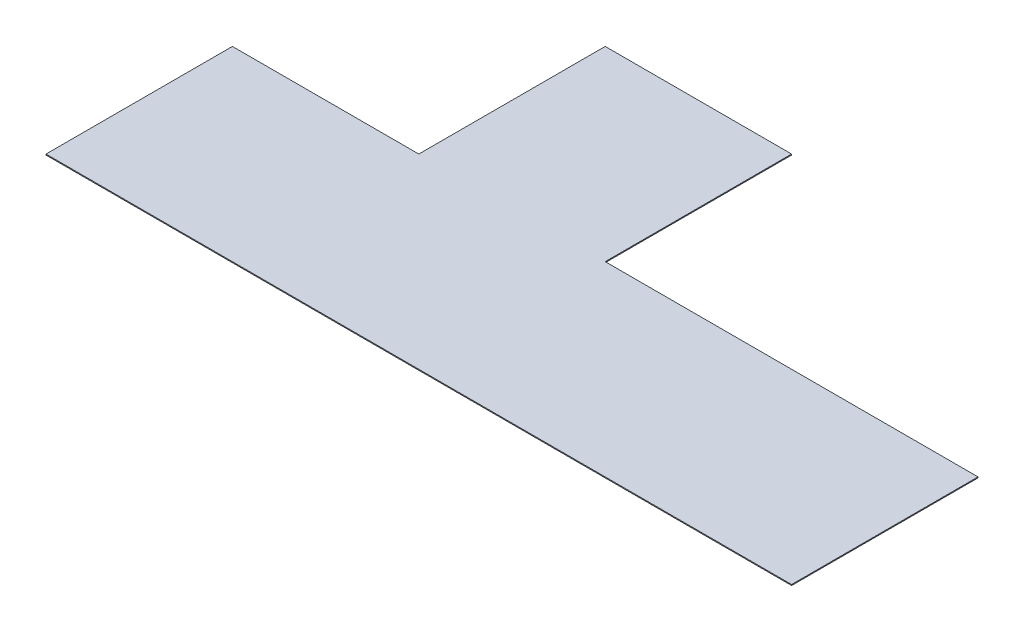
ISO-10303-21;
HEADER;
FILE_DESCRIPTION(('STEP AP214'),'2;1');
FILE_NAME('part.step','',(''),(''),'','','');
FILE_SCHEMA(('AUTOMOTIVE_DESIGN { 1 0 10303 214 1 1 1 1 }'));
ENDSEC;
DATA;
#1=APPLICATION_CONTEXT('core data for automotive mechanical design processes');
#2=APPLICATION_PROTOCOL_DEFINITION('international standard','automotive_design',2000,#1);
#3=PRODUCT_CONTEXT('',#1,'mechanical');
#4=PRODUCT('Part','Part','',(#3));
#5=PRODUCT_RELATED_PRODUCT_CATEGORY('part','',(#4));
#6=PRODUCT_DEFINITION_FORMATION('','',#4);
#7=PRODUCT_DEFINITION_CONTEXT('part definition',#1,'design');
#8=PRODUCT_DEFINITION('design','',#6,#7);
#9=PRODUCT_DEFINITION_SHAPE('','',#8);
#10=(LENGTH_UNIT() NAMED_UNIT(*) SI_UNIT(.MILLI.,.METRE.));
#11=(NAMED_UNIT(*) PLANE_ANGLE_UNIT() SI_UNIT($,.RADIAN.));
#12=(NAMED_UNIT(*) SI_UNIT($,.STERADIAN.) SOLID_ANGLE_UNIT());
#13=UNCERTAINTY_MEASURE_WITH_UNIT(LENGTH_MEASURE(1.E-05),#10,'distance_accuracy_value','');
#14=(GEOMETRIC_REPRESENTATION_CONTEXT(3) GLOBAL_UNCERTAINTY_ASSIGNED_CONTEXT((#13)) GLOBAL_UNIT_ASSIGNED_CONTEXT((#10,
#11,#12)) REPRESENTATION_CONTEXT('',''));
#15=CARTESIAN_POINT('',(0.,0.,0.));
#16=DIRECTION('',(0.,0.,1.));
#17=DIRECTION('',(1.,0.,0.));
#18=AXIS2_PLACEMENT_3D('',#15,#16,#17);
#19=CARTESIAN_POINT('',(4.37318429210749,2.601,2.65519290970218E-13));
#20=DIRECTION('',(1.,0.,0.));
#21=DIRECTION('',(0.,0.,-1.));
#22=AXIS2_PLACEMENT_3D('',#19,#20,#21);
#23=PLANE('',#22);
#24=DIRECTION('',(0.,0.,1.));
#25=VECTOR('',#24,1.);
#26=CARTESIAN_POINT('',(4.37318429210749,2.6,2.65519290970218E-13));
#27=LINE('',#26,#25);
#28=CARTESIAN_POINT('',(4.37318429210738,2.6,1.71907068929163));
#29=VERTEX_POINT('',#28);
#30=CARTESIAN_POINT('',(4.37318429210738,2.6,1.91907068929162));
#31=VERTEX_POINT('',#30);
#32=EDGE_CURVE('E11',#29,#31,#27,.T.);
#33=ORIENTED_EDGE('',*,*,#32,.F.);
#34=DIRECTION('',(0.,-1.,0.));
#35=VECTOR('',#34,1.);
#36=CARTESIAN_POINT('',(4.37318429210738,2.601,1.71907068929163));
#37=LINE('',#36,#35);
#38=CARTESIAN_POINT('',(4.37318429210738,2.601,1.71907068929163));
#39=VERTEX_POINT('',#38);
#40=EDGE_CURVE('E24',#39,#29,#37,.T.);
#41=ORIENTED_EDGE('',*,*,#40,.F.);
#42=DIRECTION('',(0.,0.,1.));
#43=VECTOR('',#42,1.);
#44=CARTESIAN_POINT('',(4.37318429210749,2.601,2.65519290970218E-13));
#45=LINE('',#44,#43);
#46=CARTESIAN_POINT('',(4.37318429210738,2.601,1.91907068929162));
#47=VERTEX_POINT('',#46);
#48=EDGE_CURVE('E145',#39,#47,#45,.T.);
#49=ORIENTED_EDGE('',*,*,#48,.T.);
#50=DIRECTION('',(0.,-1.,0.));
#51=VECTOR('',#50,1.);
#52=CARTESIAN_POINT('',(4.37318429210738,2.601,1.91907068929162));
#53=LINE('',#52,#51);
#54=EDGE_CURVE('E102',#47,#31,#53,.T.);
#55=ORIENTED_EDGE('',*,*,#54,.T.);
#56=EDGE_LOOP('',(#33,#41,#49,#55));
#57=FACE_BOUND('',#56,.T.);
#58=ADVANCED_FACE('F17',(#57),#23,.T.);
#59=CARTESIAN_POINT('',(0.,2.601,1.71907068929163));
#60=DIRECTION('',(0.,0.,-1.));
#61=DIRECTION('',(-1.,0.,0.));
#62=AXIS2_PLACEMENT_3D('',#59,#60,#61);
#63=PLANE('',#62);
#64=DIRECTION('',(1.,0.,0.));
#65=VECTOR('',#64,1.);
#66=CARTESIAN_POINT('',(0.,2.6,1.71907068929163));
#67=LINE('',#66,#65);
#68=CARTESIAN_POINT('',(4.17318429210773,2.6,1.71907068929163));
#69=VERTEX_POINT('',#68);
#70=EDGE_CURVE('E142',#69,#29,#67,.T.);
#71=ORIENTED_EDGE('',*,*,#70,.F.);
#72=DIRECTION('',(0.,-1.,0.));
#73=VECTOR('',#72,1.);
#74=CARTESIAN_POINT('',(4.17318429210773,2.601,1.71907068929163));
#75=LINE('',#74,#73);
#76=CARTESIAN_POINT('',(4.17318429210773,2.601,1.71907068929163));
#77=VERTEX_POINT('',#76);
#78=EDGE_CURVE('E139',#77,#69,#75,.T.);
#79=ORIENTED_EDGE('',*,*,#78,.F.);
#80=DIRECTION('',(1.,0.,0.));
#81=VECTOR('',#80,1.);
#82=CARTESIAN_POINT('',(0.,2.601,1.71907068929163));
#83=LINE('',#82,#81);
#84=EDGE_CURVE('E136',#77,#39,#83,.T.);
#85=ORIENTED_EDGE('',*,*,#84,.T.);
#86=ORIENTED_EDGE('',*,*,#40,.T.);
#87=EDGE_LOOP('',(#71,#79,#85,#86));
#88=FACE_BOUND('',#87,.T.);
#89=ADVANCED_FACE('F147',(#88),#63,.T.);
#90=CARTESIAN_POINT('',(4.17318429210783,2.601,2.35277924735658E-13));
#91=DIRECTION('',(1.,0.,0.));
#92=DIRECTION('',(0.,0.,-1.));
#93=AXIS2_PLACEMENT_3D('',#90,#91,#92);
#94=PLANE('',#93);
#95=DIRECTION('',(0.,0.,1.));
#96=VECTOR('',#95,1.);
#97=CARTESIAN_POINT('',(4.17318429210783,2.6,2.35277924735658E-13));
#98=LINE('',#97,#96);
#99=CARTESIAN_POINT('',(4.17318429210772,2.6,1.91907068929162));
#100=VERTEX_POINT('',#99);
#101=EDGE_CURVE('E134',#69,#100,#98,.T.);
#102=ORIENTED_EDGE('',*,*,#101,.T.);
#103=DIRECTION('',(0.,-1.,0.));
#104=VECTOR('',#103,1.);
#105=CARTESIAN_POINT('',(4.17318429210772,2.601,1.91907068929162));
#106=LINE('',#105,#104);
#107=CARTESIAN_POINT('',(4.17318429210772,2.601,1.91907068929162));
#108=VERTEX_POINT('',#107);
#109=EDGE_CURVE('E131',#108,#100,#106,.T.);
#110=ORIENTED_EDGE('',*,*,#109,.F.);
#111=DIRECTION('',(0.,0.,1.));
#112=VECTOR('',#111,1.);
#113=CARTESIAN_POINT('',(4.17318429210783,2.601,2.35277924735658E-13));
#114=LINE('',#113,#112);
#115=EDGE_CURVE('E128',#77,#108,#114,.T.);
#116=ORIENTED_EDGE('',*,*,#115,.F.);
#117=ORIENTED_EDGE('',*,*,#78,.T.);
#118=EDGE_LOOP('',(#102,#110,#116,#117));
#119=FACE_BOUND('',#118,.T.);
#120=ADVANCED_FACE('F153',(#119),#94,.F.);
#121=CARTESIAN_POINT('',(0.,2.601,1.91907068929162));
#122=DIRECTION('',(0.,0.,-1.));
#123=DIRECTION('',(-1.,0.,0.));
#124=AXIS2_PLACEMENT_3D('',#121,#122,#123);
#125=PLANE('',#124);
#126=DIRECTION('',(1.,0.,0.));
#127=VECTOR('',#126,1.);
#128=CARTESIAN_POINT('',(0.,2.6,1.91907068929162));
#129=LINE('',#128,#127);
#130=CARTESIAN_POINT('',(3.97318429210807,2.6,1.91907068929162));
#131=VERTEX_POINT('',#130);
#132=EDGE_CURVE('E125',#131,#100,#129,.T.);
#133=ORIENTED_EDGE('',*,*,#132,.F.);
#134=DIRECTION('',(0.,-1.,0.));
#135=VECTOR('',#134,1.);
#136=CARTESIAN_POINT('',(3.97318429210807,2.601,1.91907068929162));
#137=LINE('',#136,#135);
#138=CARTESIAN_POINT('',(3.97318429210807,2.601,1.91907068929162));
#139=VERTEX_POINT('',#138);
#140=EDGE_CURVE('E122',#139,#131,#137,.T.);
#141=ORIENTED_EDGE('',*,*,#140,.F.);
#142=DIRECTION('',(1.,0.,0.));
#143=VECTOR('',#142,1.);
#144=CARTESIAN_POINT('',(0.,2.601,1.91907068929162));
#145=LINE('',#144,#143);
#146=EDGE_CURVE('E119',#139,#108,#145,.T.);
#147=ORIENTED_EDGE('',*,*,#146,.T.);
#148=ORIENTED_EDGE('',*,*,#109,.T.);
#149=EDGE_LOOP('',(#133,#141,#147,#148));
#150=FACE_BOUND('',#149,.T.);
#151=ADVANCED_FACE('F156',(#150),#125,.T.);
#152=CARTESIAN_POINT('',(3.97318429210807,2.601,0.));
#153=DIRECTION('',(1.,0.,0.));
#154=DIRECTION('',(0.,0.,-1.));
#155=AXIS2_PLACEMENT_3D('',#152,#153,#154);
#156=PLANE('',#155);
#157=DIRECTION('',(0.,0.,1.));
#158=VECTOR('',#157,1.);
#159=CARTESIAN_POINT('',(3.97318429210807,2.6,0.));
#160=LINE('',#159,#158);
#161=CARTESIAN_POINT('',(3.97318429210807,2.6,2.11907068929162));
#162=VERTEX_POINT('',#161);
#163=EDGE_CURVE('E117',#131,#162,#160,.T.);
#164=ORIENTED_EDGE('',*,*,#163,.T.);
#165=DIRECTION('',(0.,-1.,0.));
#166=VECTOR('',#165,1.);
#167=CARTESIAN_POINT('',(3.97318429210807,2.601,2.11907068929162));
#168=LINE('',#167,#166);
#169=CARTESIAN_POINT('',(3.97318429210807,2.601,2.11907068929162));
#170=VERTEX_POINT('',#169);
#171=EDGE_CURVE('E114',#170,#162,#168,.T.);
#172=ORIENTED_EDGE('',*,*,#171,.F.);
#173=DIRECTION('',(0.,0.,1.));
#174=VECTOR('',#173,1.);
#175=CARTESIAN_POINT('',(3.97318429210807,2.601,0.));
#176=LINE('',#175,#174);
#177=EDGE_CURVE('E112',#139,#170,#176,.T.);
#178=ORIENTED_EDGE('',*,*,#177,.F.);
#179=ORIENTED_EDGE('',*,*,#140,.T.);
#180=EDGE_LOOP('',(#164,#172,#178,#179));
#181=FACE_BOUND('',#180,.T.);
#182=ADVANCED_FACE('F160',(#181),#156,.F.);
#183=CARTESIAN_POINT('',(0.,2.601,2.11907068929162));
#184=DIRECTION('',(0.,0.,-1.));
#185=DIRECTION('',(-1.,0.,0.));
#186=AXIS2_PLACEMENT_3D('',#183,#184,#185);
#187=PLANE('',#186);
#188=DIRECTION('',(1.,0.,0.));
#189=VECTOR('',#188,1.);
#190=CARTESIAN_POINT('',(0.,2.6,2.11907068929162));
#191=LINE('',#190,#189);
#192=CARTESIAN_POINT('',(4.7731842921067,2.6,2.11907068929162));
#193=VERTEX_POINT('',#192);
#194=EDGE_CURVE('E110',#162,#193,#191,.T.);
#195=ORIENTED_EDGE('',*,*,#194,.T.);
#196=DIRECTION('',(0.,-1.,0.));
#197=VECTOR('',#196,1.);
#198=CARTESIAN_POINT('',(4.7731842921067,2.601,2.11907068929162));
#199=LINE('',#198,#197);
#200=CARTESIAN_POINT('',(4.7731842921067,2.601,2.11907068929162));
#201=VERTEX_POINT('',#200);
#202=EDGE_CURVE('E108',#201,#193,#199,.T.);
#203=ORIENTED_EDGE('',*,*,#202,.F.);
#204=DIRECTION('',(1.,0.,0.));
#205=VECTOR('',#204,1.);
#206=CARTESIAN_POINT('',(0.,2.601,2.11907068929162));
#207=LINE('',#206,#205);
#208=EDGE_CURVE('E97',#170,#201,#207,.T.);
#209=ORIENTED_EDGE('',*,*,#208,.F.);
#210=ORIENTED_EDGE('',*,*,#171,.T.);
#211=EDGE_LOOP('',(#195,#203,#209,#210));
#212=FACE_BOUND('',#211,.T.);
#213=ADVANCED_FACE('F163',(#212),#187,.F.);
#214=CARTESIAN_POINT('',(4.77318429210682,2.601,2.69105032517149E-13));
#215=DIRECTION('',(1.,0.,0.));
#216=DIRECTION('',(0.,0.,-1.));
#217=AXIS2_PLACEMENT_3D('',#214,#215,#216);
#218=PLANE('',#217);
#219=DIRECTION('',(0.,0.,1.));
#220=VECTOR('',#219,1.);
#221=CARTESIAN_POINT('',(4.77318429210682,2.6,2.69105032517149E-13));
#222=LINE('',#221,#220);
#223=CARTESIAN_POINT('',(4.7731842921067,2.6,1.91907068929162));
#224=VERTEX_POINT('',#223);
#225=EDGE_CURVE('E84',#224,#193,#222,.T.);
#226=ORIENTED_EDGE('',*,*,#225,.F.);
#227=DIRECTION('',(0.,-1.,0.));
#228=VECTOR('',#227,1.);
#229=CARTESIAN_POINT('',(4.7731842921067,2.601,1.91907068929162));
#230=LINE('',#229,#228);
#231=CARTESIAN_POINT('',(4.7731842921067,2.601,1.91907068929162));
#232=VERTEX_POINT('',#231);
#233=EDGE_CURVE('E78',#232,#224,#230,.T.);
#234=ORIENTED_EDGE('',*,*,#233,.F.);
#235=DIRECTION('',(0.,0.,1.));
#236=VECTOR('',#235,1.);
#237=CARTESIAN_POINT('',(4.77318429210682,2.601,2.69105032517149E-13));
#238=LINE('',#237,#236);
#239=EDGE_CURVE('E82',#232,#201,#238,.T.);
#240=ORIENTED_EDGE('',*,*,#239,.T.);
#241=ORIENTED_EDGE('',*,*,#202,.T.);
#242=EDGE_LOOP('',(#226,#234,#240,#241));
#243=FACE_BOUND('',#242,.T.);
#244=ADVANCED_FACE('F80',(#243),#218,.T.);
#245=CARTESIAN_POINT('',(0.,2.601,1.91907068929162));
#246=DIRECTION('',(0.,0.,-1.));
#247=DIRECTION('',(-1.,0.,0.));
#248=AXIS2_PLACEMENT_3D('',#245,#246,#247);
#249=PLANE('',#248);
#250=DIRECTION('',(1.,0.,0.));
#251=VECTOR('',#250,1.);
#252=CARTESIAN_POINT('',(0.,2.6,1.91907068929162));
#253=LINE('',#252,#251);
#254=EDGE_CURVE('E98',#31,#224,#253,.T.);
#255=ORIENTED_EDGE('',*,*,#254,.F.);
#256=ORIENTED_EDGE('',*,*,#54,.F.);
#257=DIRECTION('',(1.,0.,0.));
#258=VECTOR('',#257,1.);
#259=CARTESIAN_POINT('',(0.,2.601,1.91907068929162));
#260=LINE('',#259,#258);
#261=EDGE_CURVE('E94',#47,#232,#260,.T.);
#262=ORIENTED_EDGE('',*,*,#261,.T.);
#263=ORIENTED_EDGE('',*,*,#233,.T.);
#264=EDGE_LOOP('',(#255,#256,#262,#263));
#265=FACE_BOUND('',#264,.T.);
#266=ADVANCED_FACE('F101',(#265),#249,.T.);
#267=CARTESIAN_POINT('',(0.,2.601,0.));
#268=DIRECTION('',(0.,1.,0.));
#269=DIRECTION('',(0.,0.,1.));
#270=AXIS2_PLACEMENT_3D('',#267,#268,#269);
#271=PLANE('',#270);
#272=ORIENTED_EDGE('',*,*,#48,.F.);
#273=ORIENTED_EDGE('',*,*,#84,.F.);
#274=ORIENTED_EDGE('',*,*,#115,.T.);
#275=ORIENTED_EDGE('',*,*,#146,.F.);
#276=ORIENTED_EDGE('',*,*,#177,.T.);
#277=ORIENTED_EDGE('',*,*,#208,.T.);
#278=ORIENTED_EDGE('',*,*,#239,.F.);
#279=ORIENTED_EDGE('',*,*,#261,.F.);
#280=EDGE_LOOP('',(#272,#273,#274,#275,#276,#277,#278,#279));
#281=FACE_BOUND('',#280,.T.);
#282=ADVANCED_FACE('F93',(#281),#271,.T.);
#283=CARTESIAN_POINT('',(0.,2.6,0.));
#284=DIRECTION('',(0.,1.,0.));
#285=DIRECTION('',(0.,0.,1.));
#286=AXIS2_PLACEMENT_3D('',#283,#284,#285);
#287=PLANE('',#286);
#288=ORIENTED_EDGE('',*,*,#32,.T.);
#289=ORIENTED_EDGE('',*,*,#254,.T.);
#290=ORIENTED_EDGE('',*,*,#225,.T.);
#291=ORIENTED_EDGE('',*,*,#194,.F.);
#292=ORIENTED_EDGE('',*,*,#163,.F.);
#293=ORIENTED_EDGE('',*,*,#132,.T.);
#294=ORIENTED_EDGE('',*,*,#101,.F.);
#295=ORIENTED_EDGE('',*,*,#70,.T.);
#296=EDGE_LOOP('',(#288,#289,#290,#291,#292,#293,#294,#295));
#297=FACE_BOUND('',#296,.T.);
#298=ADVANCED_FACE('F150',(#297),#287,.F.);
#299=CLOSED_SHELL('',(#58,#89,#120,#151,#182,#213,#244,#266,#282,#298));
#300=MANIFOLD_SOLID_BREP('B1',#299);
#301=ADVANCED_BREP_SHAPE_REPRESENTATION('',(#18,#300),#14);
#302=SHAPE_DEFINITION_REPRESENTATION(#9,#301);
ENDSEC;
END-ISO-10303-21;
